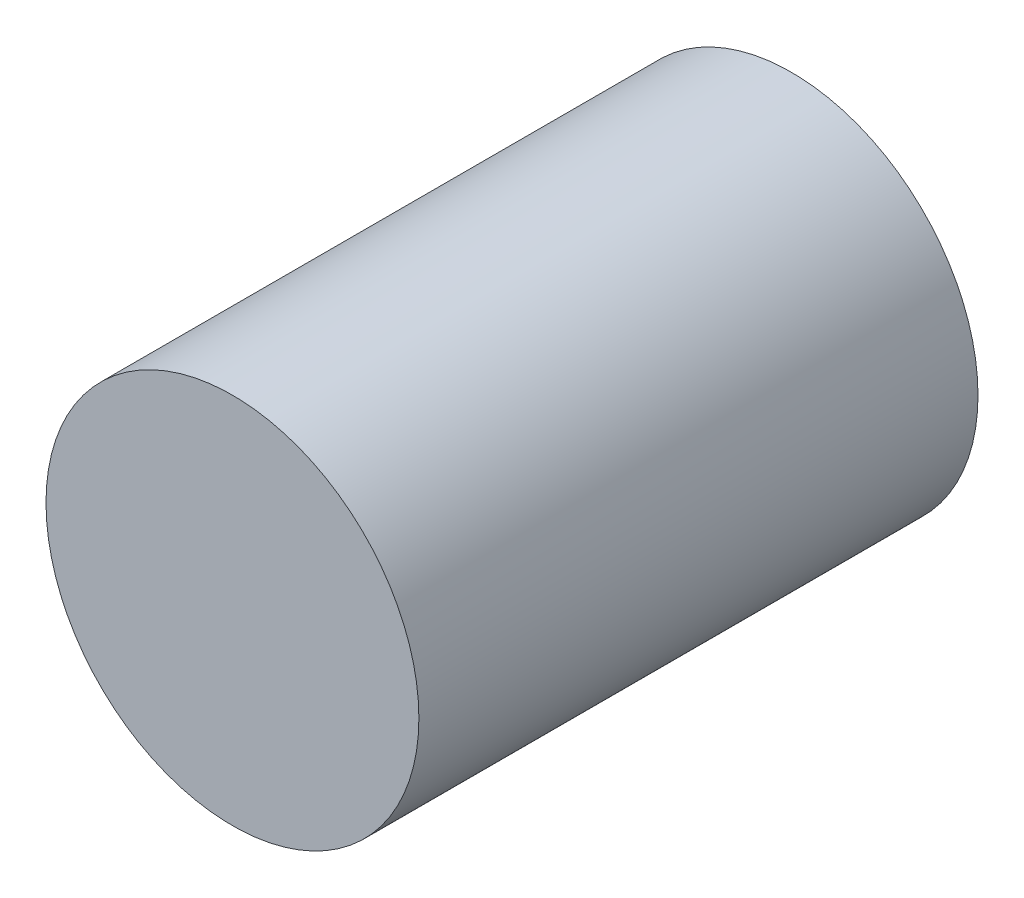
ISO-10303-21;
HEADER;
FILE_DESCRIPTION(('STEP AP214'),'2;1');
FILE_NAME('part.step','',(''),(''),'','','');
FILE_SCHEMA(('AUTOMOTIVE_DESIGN { 1 0 10303 214 1 1 1 1 }'));
ENDSEC;
DATA;
#1=APPLICATION_CONTEXT('core data for automotive mechanical design processes');
#2=APPLICATION_PROTOCOL_DEFINITION('international standard','automotive_design',2000,#1);
#3=PRODUCT_CONTEXT('',#1,'mechanical');
#4=PRODUCT('Part','Part','',(#3));
#5=PRODUCT_RELATED_PRODUCT_CATEGORY('part','',(#4));
#6=PRODUCT_DEFINITION_FORMATION('','',#4);
#7=PRODUCT_DEFINITION_CONTEXT('part definition',#1,'design');
#8=PRODUCT_DEFINITION('design','',#6,#7);
#9=PRODUCT_DEFINITION_SHAPE('','',#8);
#10=(LENGTH_UNIT() NAMED_UNIT(*) SI_UNIT(.MILLI.,.METRE.));
#11=(NAMED_UNIT(*) PLANE_ANGLE_UNIT() SI_UNIT($,.RADIAN.));
#12=(NAMED_UNIT(*) SI_UNIT($,.STERADIAN.) SOLID_ANGLE_UNIT());
#13=UNCERTAINTY_MEASURE_WITH_UNIT(LENGTH_MEASURE(1.E-05),#10,'distance_accuracy_value','');
#14=(GEOMETRIC_REPRESENTATION_CONTEXT(3) GLOBAL_UNCERTAINTY_ASSIGNED_CONTEXT((#13)) GLOBAL_UNIT_ASSIGNED_CONTEXT((#10,
#11,#12)) REPRESENTATION_CONTEXT('',''));
#15=CARTESIAN_POINT('',(0.,0.,0.));
#16=DIRECTION('',(0.,0.,1.));
#17=DIRECTION('',(1.,0.,0.));
#18=AXIS2_PLACEMENT_3D('',#15,#16,#17);
#19=CARTESIAN_POINT('',(0.,0.,-93.));
#20=DIRECTION('',(0.,0.,1.));
#21=DIRECTION('',(1.,0.,0.));
#22=AXIS2_PLACEMENT_3D('',#19,#20,#21);
#23=PLANE('',#22);
#24=CARTESIAN_POINT('',(0.,0.,-93.));
#25=DIRECTION('',(0.,0.,1.));
#26=DIRECTION('',(1.,0.,0.));
#27=AXIS2_PLACEMENT_3D('',#24,#25,#26);
#28=CIRCLE('',#27,62.0266643496342);
#29=CARTESIAN_POINT('',(62.0266643496342,0.,-93.));
#30=VERTEX_POINT('',#29);
#31=EDGE_CURVE('E44',#30,#30,#28,.T.);
#32=ORIENTED_EDGE('',*,*,#31,.F.);
#33=EDGE_LOOP('',(#32));
#34=FACE_BOUND('',#33,.T.);
#35=ADVANCED_FACE('F37',(#34),#23,.F.);
#36=CARTESIAN_POINT('',(0.,0.,93.));
#37=DIRECTION('',(0.,0.,1.));
#38=DIRECTION('',(1.,0.,0.));
#39=AXIS2_PLACEMENT_3D('',#36,#37,#38);
#40=PLANE('',#39);
#41=CARTESIAN_POINT('',(0.,0.,93.));
#42=DIRECTION('',(0.,0.,1.));
#43=DIRECTION('',(1.,0.,0.));
#44=AXIS2_PLACEMENT_3D('',#41,#42,#43);
#45=CIRCLE('',#44,62.0266643496342);
#46=CARTESIAN_POINT('',(62.0266643496342,0.,93.));
#47=VERTEX_POINT('',#46);
#48=EDGE_CURVE('E10',#47,#47,#45,.T.);
#49=ORIENTED_EDGE('',*,*,#48,.T.);
#50=EDGE_LOOP('',(#49));
#51=FACE_BOUND('',#50,.T.);
#52=ADVANCED_FACE('F61',(#51),#40,.T.);
#53=CARTESIAN_POINT('',(0.,0.,-93.));
#54=DIRECTION('',(0.,0.,1.));
#55=DIRECTION('',(1.,0.,0.));
#56=AXIS2_PLACEMENT_3D('',#53,#54,#55);
#57=CYLINDRICAL_SURFACE('',#56,62.0266643496342);
#58=ORIENTED_EDGE('',*,*,#31,.T.);
#59=EDGE_LOOP('',(#58));
#60=FACE_BOUND('',#59,.T.);
#61=ORIENTED_EDGE('',*,*,#48,.F.);
#62=EDGE_LOOP('',(#61));
#63=FACE_BOUND('',#62,.T.);
#64=ADVANCED_FACE('F57',(#60,#63),#57,.T.);
#65=CLOSED_SHELL('',(#35,#52,#64));
#66=MANIFOLD_SOLID_BREP('B2',#65);
#67=ADVANCED_BREP_SHAPE_REPRESENTATION('',(#18,#66),#14);
#68=SHAPE_DEFINITION_REPRESENTATION(#9,#67);
ENDSEC;
END-ISO-10303-21;
